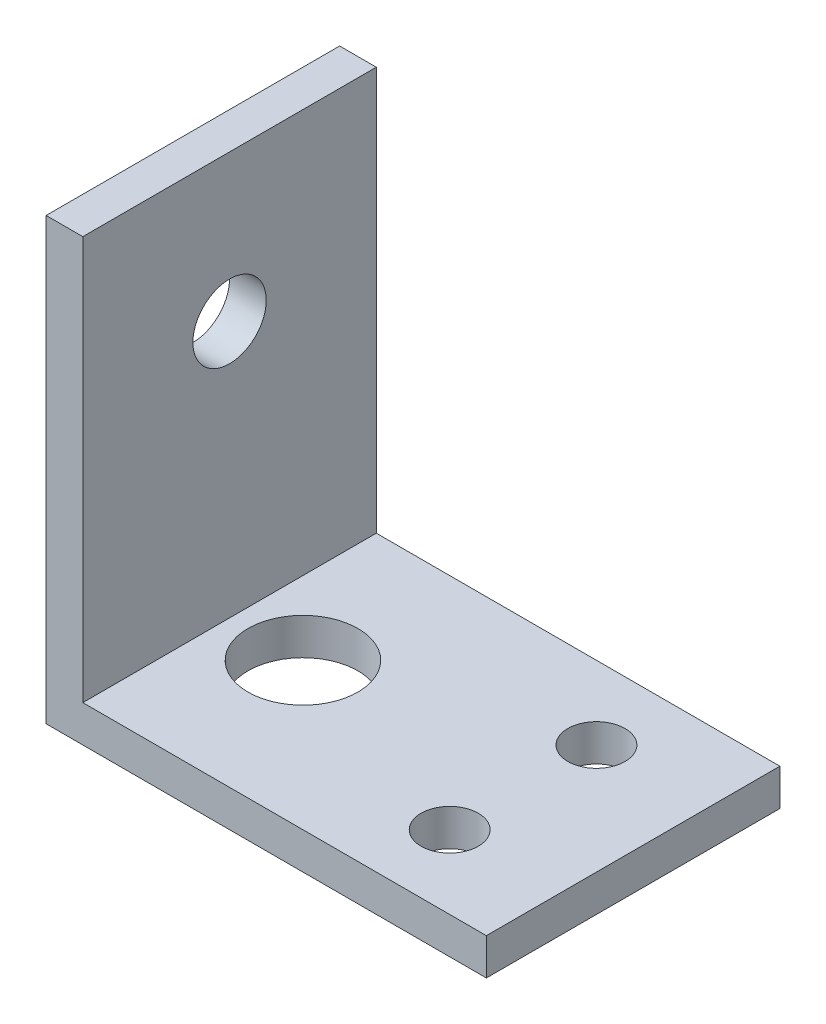
ISO-10303-21;
HEADER;
FILE_DESCRIPTION(('STEP AP214'),'2;1');
FILE_NAME('part.step','',(''),(''),'','','');
FILE_SCHEMA(('AUTOMOTIVE_DESIGN { 1 0 10303 214 1 1 1 1 }'));
ENDSEC;
DATA;
#1=APPLICATION_CONTEXT('core data for automotive mechanical design processes');
#2=APPLICATION_PROTOCOL_DEFINITION('international standard','automotive_design',2000,#1);
#3=PRODUCT_CONTEXT('',#1,'mechanical');
#4=PRODUCT('Part','Part','',(#3));
#5=PRODUCT_RELATED_PRODUCT_CATEGORY('part','',(#4));
#6=PRODUCT_DEFINITION_FORMATION('','',#4);
#7=PRODUCT_DEFINITION_CONTEXT('part definition',#1,'design');
#8=PRODUCT_DEFINITION('design','',#6,#7);
#9=PRODUCT_DEFINITION_SHAPE('','',#8);
#10=(LENGTH_UNIT() NAMED_UNIT(*) SI_UNIT(.MILLI.,.METRE.));
#11=(NAMED_UNIT(*) PLANE_ANGLE_UNIT() SI_UNIT($,.RADIAN.));
#12=(NAMED_UNIT(*) SI_UNIT($,.STERADIAN.) SOLID_ANGLE_UNIT());
#13=UNCERTAINTY_MEASURE_WITH_UNIT(LENGTH_MEASURE(1.E-05),#10,'distance_accuracy_value','');
#14=(GEOMETRIC_REPRESENTATION_CONTEXT(3) GLOBAL_UNCERTAINTY_ASSIGNED_CONTEXT((#13)) GLOBAL_UNIT_ASSIGNED_CONTEXT((#10,
#11,#12)) REPRESENTATION_CONTEXT('',''));
#15=CARTESIAN_POINT('',(0.,0.,0.));
#16=DIRECTION('',(0.,0.,1.));
#17=DIRECTION('',(1.,0.,0.));
#18=AXIS2_PLACEMENT_3D('',#15,#16,#17);
#19=CARTESIAN_POINT('',(3.175,0.,25.4));
#20=DIRECTION('',(-1.,0.,0.));
#21=DIRECTION('',(0.,0.,1.));
#22=AXIS2_PLACEMENT_3D('',#19,#20,#21);
#23=PLANE('',#22);
#24=CARTESIAN_POINT('',(3.175,25.4,12.7));
#25=DIRECTION('',(-1.,0.,0.));
#26=DIRECTION('',(0.,0.,1.));
#27=AXIS2_PLACEMENT_3D('',#24,#25,#26);
#28=CIRCLE('',#27,3.175);
#29=CARTESIAN_POINT('',(3.175,25.4,15.875));
#30=VERTEX_POINT('',#29);
#31=EDGE_CURVE('E148',#30,#30,#28,.T.);
#32=ORIENTED_EDGE('',*,*,#31,.T.);
#33=EDGE_LOOP('',(#32));
#34=FACE_BOUND('',#33,.T.);
#35=DIRECTION('',(0.,1.,0.));
#36=VECTOR('',#35,1.);
#37=CARTESIAN_POINT('',(3.175,0.,0.));
#38=LINE('',#37,#36);
#39=CARTESIAN_POINT('',(3.175,3.175,0.));
#40=VERTEX_POINT('',#39);
#41=CARTESIAN_POINT('',(3.175,38.1,0.));
#42=VERTEX_POINT('',#41);
#43=EDGE_CURVE('E118',#40,#42,#38,.T.);
#44=ORIENTED_EDGE('',*,*,#43,.T.);
#45=DIRECTION('',(0.,0.,-1.));
#46=VECTOR('',#45,1.);
#47=CARTESIAN_POINT('',(3.175,38.1,25.4));
#48=LINE('',#47,#46);
#49=CARTESIAN_POINT('',(3.175,38.1,25.4));
#50=VERTEX_POINT('',#49);
#51=EDGE_CURVE('E11',#50,#42,#48,.T.);
#52=ORIENTED_EDGE('',*,*,#51,.F.);
#53=DIRECTION('',(0.,1.,0.));
#54=VECTOR('',#53,1.);
#55=CARTESIAN_POINT('',(3.175,0.,25.4));
#56=LINE('',#55,#54);
#57=CARTESIAN_POINT('',(3.175,3.175,25.4));
#58=VERTEX_POINT('',#57);
#59=EDGE_CURVE('E83',#58,#50,#56,.T.);
#60=ORIENTED_EDGE('',*,*,#59,.F.);
#61=DIRECTION('',(0.,0.,-1.));
#62=VECTOR('',#61,1.);
#63=CARTESIAN_POINT('',(3.175,3.175,25.4));
#64=LINE('',#63,#62);
#65=EDGE_CURVE('E114',#58,#40,#64,.T.);
#66=ORIENTED_EDGE('',*,*,#65,.T.);
#67=EDGE_LOOP('',(#44,#52,#60,#66));
#68=FACE_BOUND('',#67,.T.);
#69=ADVANCED_FACE('F35',(#34,#68),#23,.F.);
#70=CARTESIAN_POINT('',(0.,38.1,25.4));
#71=DIRECTION('',(0.,1.,0.));
#72=DIRECTION('',(0.,0.,1.));
#73=AXIS2_PLACEMENT_3D('',#70,#71,#72);
#74=PLANE('',#73);
#75=DIRECTION('',(1.,0.,0.));
#76=VECTOR('',#75,1.);
#77=CARTESIAN_POINT('',(0.,38.1,0.));
#78=LINE('',#77,#76);
#79=CARTESIAN_POINT('',(0.,38.1,0.));
#80=VERTEX_POINT('',#79);
#81=EDGE_CURVE('E121',#80,#42,#78,.T.);
#82=ORIENTED_EDGE('',*,*,#81,.F.);
#83=DIRECTION('',(0.,0.,-1.));
#84=VECTOR('',#83,1.);
#85=CARTESIAN_POINT('',(0.,38.1,25.4));
#86=LINE('',#85,#84);
#87=CARTESIAN_POINT('',(0.,38.1,25.4));
#88=VERTEX_POINT('',#87);
#89=EDGE_CURVE('E44',#88,#80,#86,.T.);
#90=ORIENTED_EDGE('',*,*,#89,.F.);
#91=DIRECTION('',(1.,0.,0.));
#92=VECTOR('',#91,1.);
#93=CARTESIAN_POINT('',(0.,38.1,25.4));
#94=LINE('',#93,#92);
#95=EDGE_CURVE('E158',#88,#50,#94,.T.);
#96=ORIENTED_EDGE('',*,*,#95,.T.);
#97=ORIENTED_EDGE('',*,*,#51,.T.);
#98=EDGE_LOOP('',(#82,#90,#96,#97));
#99=FACE_BOUND('',#98,.T.);
#100=ADVANCED_FACE('F180',(#99),#74,.T.);
#101=CARTESIAN_POINT('',(0.,0.,25.4));
#102=DIRECTION('',(-1.,0.,0.));
#103=DIRECTION('',(0.,0.,1.));
#104=AXIS2_PLACEMENT_3D('',#101,#102,#103);
#105=PLANE('',#104);
#106=CARTESIAN_POINT('',(0.,25.4,12.7));
#107=DIRECTION('',(-1.,0.,0.));
#108=DIRECTION('',(0.,0.,1.));
#109=AXIS2_PLACEMENT_3D('',#106,#107,#108);
#110=CIRCLE('',#109,3.175);
#111=CARTESIAN_POINT('',(0.,25.4,15.875));
#112=VERTEX_POINT('',#111);
#113=EDGE_CURVE('E189',#112,#112,#110,.T.);
#114=ORIENTED_EDGE('',*,*,#113,.F.);
#115=EDGE_LOOP('',(#114));
#116=FACE_BOUND('',#115,.T.);
#117=DIRECTION('',(0.,1.,0.));
#118=VECTOR('',#117,1.);
#119=CARTESIAN_POINT('',(0.,0.,0.));
#120=LINE('',#119,#118);
#121=CARTESIAN_POINT('',(0.,0.,0.));
#122=VERTEX_POINT('',#121);
#123=EDGE_CURVE('E125',#122,#80,#120,.T.);
#124=ORIENTED_EDGE('',*,*,#123,.F.);
#125=DIRECTION('',(0.,0.,-1.));
#126=VECTOR('',#125,1.);
#127=CARTESIAN_POINT('',(0.,0.,25.4));
#128=LINE('',#127,#126);
#129=CARTESIAN_POINT('',(0.,0.,25.4));
#130=VERTEX_POINT('',#129);
#131=EDGE_CURVE('E104',#130,#122,#128,.T.);
#132=ORIENTED_EDGE('',*,*,#131,.F.);
#133=DIRECTION('',(0.,1.,0.));
#134=VECTOR('',#133,1.);
#135=CARTESIAN_POINT('',(0.,0.,25.4));
#136=LINE('',#135,#134);
#137=EDGE_CURVE('E110',#130,#88,#136,.T.);
#138=ORIENTED_EDGE('',*,*,#137,.T.);
#139=ORIENTED_EDGE('',*,*,#89,.T.);
#140=EDGE_LOOP('',(#124,#132,#138,#139));
#141=FACE_BOUND('',#140,.T.);
#142=ADVANCED_FACE('F162',(#116,#141),#105,.T.);
#143=CARTESIAN_POINT('',(0.,0.,25.4));
#144=DIRECTION('',(0.,-1.,0.));
#145=DIRECTION('',(0.,0.,-1.));
#146=AXIS2_PLACEMENT_3D('',#143,#144,#145);
#147=PLANE('',#146);
#148=CARTESIAN_POINT('',(28.575,0.,6.34999999999999));
#149=DIRECTION('',(0.,-1.,0.));
#150=DIRECTION('',(0.,0.,-1.));
#151=AXIS2_PLACEMENT_3D('',#148,#149,#150);
#152=CIRCLE('',#151,2.4765);
#153=CARTESIAN_POINT('',(28.575,0.,3.87349999999999));
#154=VERTEX_POINT('',#153);
#155=EDGE_CURVE('E137',#154,#154,#152,.T.);
#156=ORIENTED_EDGE('',*,*,#155,.F.);
#157=EDGE_LOOP('',(#156));
#158=FACE_BOUND('',#157,.T.);
#159=CARTESIAN_POINT('',(28.575,0.,19.05));
#160=DIRECTION('',(0.,-1.,0.));
#161=DIRECTION('',(0.,0.,-1.));
#162=AXIS2_PLACEMENT_3D('',#159,#160,#161);
#163=CIRCLE('',#162,2.47650000000001);
#164=CARTESIAN_POINT('',(28.575,0.,16.5735));
#165=VERTEX_POINT('',#164);
#166=EDGE_CURVE('E143',#165,#165,#163,.T.);
#167=ORIENTED_EDGE('',*,*,#166,.F.);
#168=EDGE_LOOP('',(#167));
#169=FACE_BOUND('',#168,.T.);
#170=CARTESIAN_POINT('',(9.525,0.,12.7));
#171=DIRECTION('',(0.,1.,0.));
#172=DIRECTION('',(0.,0.,1.));
#173=AXIS2_PLACEMENT_3D('',#170,#171,#172);
#174=CIRCLE('',#173,4.7625);
#175=CARTESIAN_POINT('',(9.525,0.,17.4625));
#176=VERTEX_POINT('',#175);
#177=EDGE_CURVE('E122',#176,#176,#174,.T.);
#178=ORIENTED_EDGE('',*,*,#177,.T.);
#179=EDGE_LOOP('',(#178));
#180=FACE_BOUND('',#179,.T.);
#181=DIRECTION('',(-1.,0.,0.));
#182=VECTOR('',#181,1.);
#183=CARTESIAN_POINT('',(0.,0.,0.));
#184=LINE('',#183,#182);
#185=CARTESIAN_POINT('',(38.1,0.,0.));
#186=VERTEX_POINT('',#185);
#187=EDGE_CURVE('E99',#186,#122,#184,.T.);
#188=ORIENTED_EDGE('',*,*,#187,.F.);
#189=DIRECTION('',(0.,0.,-1.));
#190=VECTOR('',#189,1.);
#191=CARTESIAN_POINT('',(38.1,0.,25.4));
#192=LINE('',#191,#190);
#193=CARTESIAN_POINT('',(38.1,0.,25.4));
#194=VERTEX_POINT('',#193);
#195=EDGE_CURVE('E94',#194,#186,#192,.T.);
#196=ORIENTED_EDGE('',*,*,#195,.F.);
#197=DIRECTION('',(-1.,0.,0.));
#198=VECTOR('',#197,1.);
#199=CARTESIAN_POINT('',(0.,0.,25.4));
#200=LINE('',#199,#198);
#201=EDGE_CURVE('E97',#194,#130,#200,.T.);
#202=ORIENTED_EDGE('',*,*,#201,.T.);
#203=ORIENTED_EDGE('',*,*,#131,.T.);
#204=EDGE_LOOP('',(#188,#196,#202,#203));
#205=FACE_BOUND('',#204,.T.);
#206=ADVANCED_FACE('F96',(#158,#169,#180,#205),#147,.T.);
#207=CARTESIAN_POINT('',(38.1,3.175,25.4));
#208=DIRECTION('',(1.,0.,0.));
#209=DIRECTION('',(0.,0.,-1.));
#210=AXIS2_PLACEMENT_3D('',#207,#208,#209);
#211=PLANE('',#210);
#212=DIRECTION('',(0.,-1.,0.));
#213=VECTOR('',#212,1.);
#214=CARTESIAN_POINT('',(38.1,3.175,0.));
#215=LINE('',#214,#213);
#216=CARTESIAN_POINT('',(38.1,3.175,0.));
#217=VERTEX_POINT('',#216);
#218=EDGE_CURVE('E129',#217,#186,#215,.T.);
#219=ORIENTED_EDGE('',*,*,#218,.F.);
#220=DIRECTION('',(0.,0.,-1.));
#221=VECTOR('',#220,1.);
#222=CARTESIAN_POINT('',(38.1,3.175,25.4));
#223=LINE('',#222,#221);
#224=CARTESIAN_POINT('',(38.1,3.175,25.4));
#225=VERTEX_POINT('',#224);
#226=EDGE_CURVE('E74',#225,#217,#223,.T.);
#227=ORIENTED_EDGE('',*,*,#226,.F.);
#228=DIRECTION('',(0.,-1.,0.));
#229=VECTOR('',#228,1.);
#230=CARTESIAN_POINT('',(38.1,3.175,25.4));
#231=LINE('',#230,#229);
#232=EDGE_CURVE('E108',#225,#194,#231,.T.);
#233=ORIENTED_EDGE('',*,*,#232,.T.);
#234=ORIENTED_EDGE('',*,*,#195,.T.);
#235=EDGE_LOOP('',(#219,#227,#233,#234));
#236=FACE_BOUND('',#235,.T.);
#237=ADVANCED_FACE('F112',(#236),#211,.T.);
#238=CARTESIAN_POINT('',(0.,3.175,25.4));
#239=DIRECTION('',(0.,-1.,0.));
#240=DIRECTION('',(0.,0.,-1.));
#241=AXIS2_PLACEMENT_3D('',#238,#239,#240);
#242=PLANE('',#241);
#243=CARTESIAN_POINT('',(28.575,3.175,6.34999999999999));
#244=DIRECTION('',(0.,-1.,0.));
#245=DIRECTION('',(0.,0.,-1.));
#246=AXIS2_PLACEMENT_3D('',#243,#244,#245);
#247=CIRCLE('',#246,2.4765);
#248=CARTESIAN_POINT('',(28.575,3.175,3.87349999999999));
#249=VERTEX_POINT('',#248);
#250=EDGE_CURVE('E38',#249,#249,#247,.T.);
#251=ORIENTED_EDGE('',*,*,#250,.T.);
#252=EDGE_LOOP('',(#251));
#253=FACE_BOUND('',#252,.T.);
#254=CARTESIAN_POINT('',(28.575,3.175,19.05));
#255=DIRECTION('',(0.,-1.,0.));
#256=DIRECTION('',(0.,0.,-1.));
#257=AXIS2_PLACEMENT_3D('',#254,#255,#256);
#258=CIRCLE('',#257,2.47650000000001);
#259=CARTESIAN_POINT('',(28.575,3.175,16.5735));
#260=VERTEX_POINT('',#259);
#261=EDGE_CURVE('E135',#260,#260,#258,.T.);
#262=ORIENTED_EDGE('',*,*,#261,.T.);
#263=EDGE_LOOP('',(#262));
#264=FACE_BOUND('',#263,.T.);
#265=CARTESIAN_POINT('',(9.525,3.175,12.7));
#266=DIRECTION('',(0.,1.,0.));
#267=DIRECTION('',(0.,0.,1.));
#268=AXIS2_PLACEMENT_3D('',#265,#266,#267);
#269=CIRCLE('',#268,4.7625);
#270=CARTESIAN_POINT('',(9.525,3.175,17.4625));
#271=VERTEX_POINT('',#270);
#272=EDGE_CURVE('E141',#271,#271,#269,.T.);
#273=ORIENTED_EDGE('',*,*,#272,.F.);
#274=EDGE_LOOP('',(#273));
#275=FACE_BOUND('',#274,.T.);
#276=DIRECTION('',(1.,0.,0.));
#277=VECTOR('',#276,1.);
#278=CARTESIAN_POINT('',(0.,3.175,0.));
#279=LINE('',#278,#277);
#280=EDGE_CURVE('E77',#217,#40,#279,.F.);
#281=ORIENTED_EDGE('',*,*,#280,.T.);
#282=ORIENTED_EDGE('',*,*,#65,.F.);
#283=DIRECTION('',(1.,0.,0.));
#284=VECTOR('',#283,1.);
#285=CARTESIAN_POINT('',(0.,3.175,25.4));
#286=LINE('',#285,#284);
#287=EDGE_CURVE('E53',#225,#58,#286,.F.);
#288=ORIENTED_EDGE('',*,*,#287,.F.);
#289=ORIENTED_EDGE('',*,*,#226,.T.);
#290=EDGE_LOOP('',(#281,#282,#288,#289));
#291=FACE_BOUND('',#290,.T.);
#292=ADVANCED_FACE('F168',(#253,#264,#275,#291),#242,.F.);
#293=CARTESIAN_POINT('',(0.,0.,25.4));
#294=DIRECTION('',(0.,0.,-1.));
#295=DIRECTION('',(-1.,0.,0.));
#296=AXIS2_PLACEMENT_3D('',#293,#294,#295);
#297=PLANE('',#296);
#298=ORIENTED_EDGE('',*,*,#59,.T.);
#299=ORIENTED_EDGE('',*,*,#95,.F.);
#300=ORIENTED_EDGE('',*,*,#137,.F.);
#301=ORIENTED_EDGE('',*,*,#201,.F.);
#302=ORIENTED_EDGE('',*,*,#232,.F.);
#303=ORIENTED_EDGE('',*,*,#287,.T.);
#304=EDGE_LOOP('',(#298,#299,#300,#301,#302,#303));
#305=FACE_BOUND('',#304,.T.);
#306=ADVANCED_FACE('F107',(#305),#297,.F.);
#307=CARTESIAN_POINT('',(0.,0.,0.));
#308=DIRECTION('',(0.,0.,-1.));
#309=DIRECTION('',(-1.,0.,0.));
#310=AXIS2_PLACEMENT_3D('',#307,#308,#309);
#311=PLANE('',#310);
#312=ORIENTED_EDGE('',*,*,#43,.F.);
#313=ORIENTED_EDGE('',*,*,#280,.F.);
#314=ORIENTED_EDGE('',*,*,#218,.T.);
#315=ORIENTED_EDGE('',*,*,#187,.T.);
#316=ORIENTED_EDGE('',*,*,#123,.T.);
#317=ORIENTED_EDGE('',*,*,#81,.T.);
#318=EDGE_LOOP('',(#312,#313,#314,#315,#316,#317));
#319=FACE_BOUND('',#318,.T.);
#320=ADVANCED_FACE('F166',(#319),#311,.T.);
#321=CARTESIAN_POINT('',(9.525,0.,12.7));
#322=DIRECTION('',(0.,1.,0.));
#323=DIRECTION('',(0.,0.,1.));
#324=AXIS2_PLACEMENT_3D('',#321,#322,#323);
#325=CYLINDRICAL_SURFACE('',#324,4.7625);
#326=ORIENTED_EDGE('',*,*,#177,.F.);
#327=EDGE_LOOP('',(#326));
#328=FACE_BOUND('',#327,.T.);
#329=ORIENTED_EDGE('',*,*,#272,.T.);
#330=EDGE_LOOP('',(#329));
#331=FACE_BOUND('',#330,.T.);
#332=ADVANCED_FACE('F209',(#328,#331),#325,.F.);
#333=CARTESIAN_POINT('',(28.575,38.1,19.05));
#334=DIRECTION('',(0.,-1.,0.));
#335=DIRECTION('',(0.,0.,-1.));
#336=AXIS2_PLACEMENT_3D('',#333,#334,#335);
#337=CYLINDRICAL_SURFACE('',#336,2.47650000000001);
#338=CARTESIAN_POINT('',(28.575,0.,16.5735));
#339=CARTESIAN_POINT('',(28.575,0.0330729166666659,16.5735));
#340=CARTESIAN_POINT('',(28.575,0.0661458333333318,16.5735));
#341=CARTESIAN_POINT('',(28.575,0.132291666666666,16.5735));
#342=CARTESIAN_POINT('',(28.575,0.165364583333334,16.5735));
#343=CARTESIAN_POINT('',(28.575,0.231510416666668,16.5735));
#344=CARTESIAN_POINT('',(28.575,0.264583333333334,16.5735));
#345=CARTESIAN_POINT('',(28.575,0.330729166666666,16.5735));
#346=CARTESIAN_POINT('',(28.575,0.363802083333332,16.5735));
#347=CARTESIAN_POINT('',(28.575,0.429947916666666,16.5735));
#348=CARTESIAN_POINT('',(28.575,0.463020833333334,16.5735));
#349=CARTESIAN_POINT('',(28.575,0.529166666666669,16.5735));
#350=CARTESIAN_POINT('',(28.575,0.562239583333334,16.5735));
#351=CARTESIAN_POINT('',(28.575,0.628385416666666,16.5735));
#352=CARTESIAN_POINT('',(28.575,0.661458333333332,16.5735));
#353=CARTESIAN_POINT('',(28.575,0.727604166666664,16.5735));
#354=CARTESIAN_POINT('',(28.575,0.76067708333333,16.5735));
#355=CARTESIAN_POINT('',(28.575,0.826822916666664,16.5735));
#356=CARTESIAN_POINT('',(28.575,0.859895833333332,16.5735));
#357=CARTESIAN_POINT('',(28.575,0.926041666666666,16.5735));
#358=CARTESIAN_POINT('',(28.575,0.959114583333332,16.5735));
#359=CARTESIAN_POINT('',(28.575,1.02526041666666,16.5735));
#360=CARTESIAN_POINT('',(28.575,1.05833333333333,16.5735));
#361=CARTESIAN_POINT('',(28.575,1.12447916666666,16.5735));
#362=CARTESIAN_POINT('',(28.575,1.15755208333333,16.5735));
#363=CARTESIAN_POINT('',(28.575,1.22369791666667,16.5735));
#364=CARTESIAN_POINT('',(28.575,1.25677083333333,16.5735));
#365=CARTESIAN_POINT('',(28.575,1.32291666666666,16.5735));
#366=CARTESIAN_POINT('',(28.575,1.35598958333333,16.5735));
#367=CARTESIAN_POINT('',(28.575,1.42213541666666,16.5735));
#368=CARTESIAN_POINT('',(28.575,1.45520833333333,16.5735));
#369=CARTESIAN_POINT('',(28.575,1.52135416666667,16.5735));
#370=CARTESIAN_POINT('',(28.575,1.55442708333333,16.5735));
#371=CARTESIAN_POINT('',(28.575,1.62057291666666,16.5735));
#372=CARTESIAN_POINT('',(28.575,1.65364583333333,16.5735));
#373=CARTESIAN_POINT('',(28.575,1.71979166666666,16.5735));
#374=CARTESIAN_POINT('',(28.575,1.75286458333333,16.5735));
#375=CARTESIAN_POINT('',(28.575,1.81901041666667,16.5735));
#376=CARTESIAN_POINT('',(28.575,1.85208333333333,16.5735));
#377=CARTESIAN_POINT('',(28.575,1.91822916666666,16.5735));
#378=CARTESIAN_POINT('',(28.575,1.95130208333333,16.5735));
#379=CARTESIAN_POINT('',(28.575,2.01744791666667,16.5735));
#380=CARTESIAN_POINT('',(28.575,2.05052083333333,16.5735));
#381=CARTESIAN_POINT('',(28.575,2.11666666666667,16.5735));
#382=CARTESIAN_POINT('',(28.575,2.14973958333333,16.5735));
#383=CARTESIAN_POINT('',(28.575,2.21588541666666,16.5735));
#384=CARTESIAN_POINT('',(28.575,2.24895833333333,16.5735));
#385=CARTESIAN_POINT('',(28.575,2.31510416666667,16.5735));
#386=CARTESIAN_POINT('',(28.575,2.34817708333333,16.5735));
#387=CARTESIAN_POINT('',(28.575,2.41432291666667,16.5735));
#388=CARTESIAN_POINT('',(28.575,2.44739583333333,16.5735));
#389=CARTESIAN_POINT('',(28.575,2.51354166666667,16.5735));
#390=CARTESIAN_POINT('',(28.575,2.54661458333333,16.5735));
#391=CARTESIAN_POINT('',(28.575,2.61276041666666,16.5735));
#392=CARTESIAN_POINT('',(28.575,2.64583333333333,16.5735));
#393=CARTESIAN_POINT('',(28.575,2.71197916666666,16.5735));
#394=CARTESIAN_POINT('',(28.575,2.74505208333333,16.5735));
#395=CARTESIAN_POINT('',(28.575,2.81119791666667,16.5735));
#396=CARTESIAN_POINT('',(28.575,2.84427083333333,16.5735));
#397=CARTESIAN_POINT('',(28.575,2.91041666666666,16.5735));
#398=CARTESIAN_POINT('',(28.575,2.94348958333333,16.5735));
#399=CARTESIAN_POINT('',(28.575,3.00963541666666,16.5735));
#400=CARTESIAN_POINT('',(28.575,3.04270833333333,16.5735));
#401=CARTESIAN_POINT('',(28.575,3.10885416666667,16.5735));
#402=CARTESIAN_POINT('',(28.575,3.14192708333333,16.5735));
#403=CARTESIAN_POINT('',(28.575,3.175,16.5735));
#404=B_SPLINE_CURVE_WITH_KNOTS('',3,(#338,#339,#340,#341,#342,#343,#344,#345,#346,#347,#348,
#349,#350,#351,#352,#353,#354,#355,#356,#357,#358,#359,#360,#361,#362,#363,#364,#365,#366,#367,
#368,#369,#370,#371,#372,#373,#374,#375,#376,#377,#378,#379,#380,#381,#382,#383,#384,#385,#386,
#387,#388,#389,#390,#391,#392,#393,#394,#395,#396,#397,#398,#399,#400,#401,#402,#403),
.UNSPECIFIED.,.F.,.F.,(4,2,2,2,2,2,2,2,2,2,2,2,2,2,2,2,2,2,2,2,2,2,2,2,2,2,2,2,2,2,2,2,4),(0.,
0.0992187499999977,0.198437500000002,0.29765625,0.396874999999998,0.496093750000003,0.5953125,
0.694531249999998,0.793749999999996,0.892968750000001,0.992187499999998,1.09140625,1.190625,
1.28984375,1.3890625,1.48828125,1.5875,1.68671875,1.7859375,1.88515625,1.984375,2.08359375,
2.1828125,2.28203125,2.38125,2.48046875,2.5796875,2.67890624999999,2.778125,2.87734375,
2.97656249999999,3.07578125,3.175),.UNSPECIFIED.);
#405=EDGE_CURVE('BSEAM212',#165,#260,#404,.T.);
#406=ORIENTED_EDGE('',*,*,#166,.T.);
#407=ORIENTED_EDGE('',*,*,#261,.F.);
#408=ORIENTED_EDGE('',*,*,#405,.T.);
#409=ORIENTED_EDGE('',*,*,#405,.F.);
#410=EDGE_LOOP('',(#406,#408,#407,#409));
#411=FACE_BOUND('',#410,.T.);
#412=ADVANCED_FACE('F212',(#411),#337,.F.);
#413=CARTESIAN_POINT('',(28.575,38.1,6.34999999999999));
#414=DIRECTION('',(0.,-1.,0.));
#415=DIRECTION('',(0.,0.,-1.));
#416=AXIS2_PLACEMENT_3D('',#413,#414,#415);
#417=CYLINDRICAL_SURFACE('',#416,2.4765);
#418=CARTESIAN_POINT('',(28.575,0.,3.87349999999999));
#419=CARTESIAN_POINT('',(28.575,0.0330729166666659,3.87349999999999));
#420=CARTESIAN_POINT('',(28.575,0.0661458333333318,3.87349999999999));
#421=CARTESIAN_POINT('',(28.575,0.132291666666666,3.87349999999999));
#422=CARTESIAN_POINT('',(28.575,0.165364583333334,3.87349999999999));
#423=CARTESIAN_POINT('',(28.575,0.231510416666668,3.87349999999999));
#424=CARTESIAN_POINT('',(28.575,0.264583333333334,3.87349999999999));
#425=CARTESIAN_POINT('',(28.575,0.330729166666666,3.87349999999999));
#426=CARTESIAN_POINT('',(28.575,0.363802083333332,3.87349999999999));
#427=CARTESIAN_POINT('',(28.575,0.429947916666666,3.87349999999999));
#428=CARTESIAN_POINT('',(28.575,0.463020833333334,3.87349999999999));
#429=CARTESIAN_POINT('',(28.575,0.529166666666669,3.87349999999999));
#430=CARTESIAN_POINT('',(28.575,0.562239583333334,3.87349999999999));
#431=CARTESIAN_POINT('',(28.575,0.628385416666666,3.87349999999999));
#432=CARTESIAN_POINT('',(28.575,0.661458333333332,3.87349999999999));
#433=CARTESIAN_POINT('',(28.575,0.727604166666664,3.87349999999999));
#434=CARTESIAN_POINT('',(28.575,0.76067708333333,3.87349999999999));
#435=CARTESIAN_POINT('',(28.575,0.826822916666664,3.87349999999999));
#436=CARTESIAN_POINT('',(28.575,0.859895833333332,3.87349999999999));
#437=CARTESIAN_POINT('',(28.575,0.926041666666666,3.87349999999999));
#438=CARTESIAN_POINT('',(28.575,0.959114583333332,3.87349999999999));
#439=CARTESIAN_POINT('',(28.575,1.02526041666666,3.87349999999999));
#440=CARTESIAN_POINT('',(28.575,1.05833333333333,3.87349999999999));
#441=CARTESIAN_POINT('',(28.575,1.12447916666666,3.87349999999999));
#442=CARTESIAN_POINT('',(28.575,1.15755208333333,3.87349999999999));
#443=CARTESIAN_POINT('',(28.575,1.22369791666667,3.87349999999999));
#444=CARTESIAN_POINT('',(28.575,1.25677083333333,3.87349999999999));
#445=CARTESIAN_POINT('',(28.575,1.32291666666666,3.87349999999999));
#446=CARTESIAN_POINT('',(28.575,1.35598958333333,3.87349999999999));
#447=CARTESIAN_POINT('',(28.575,1.42213541666666,3.87349999999999));
#448=CARTESIAN_POINT('',(28.575,1.45520833333333,3.87349999999999));
#449=CARTESIAN_POINT('',(28.575,1.52135416666667,3.87349999999999));
#450=CARTESIAN_POINT('',(28.575,1.55442708333333,3.87349999999999));
#451=CARTESIAN_POINT('',(28.575,1.62057291666666,3.87349999999999));
#452=CARTESIAN_POINT('',(28.575,1.65364583333333,3.87349999999999));
#453=CARTESIAN_POINT('',(28.575,1.71979166666666,3.87349999999999));
#454=CARTESIAN_POINT('',(28.575,1.75286458333333,3.87349999999999));
#455=CARTESIAN_POINT('',(28.575,1.81901041666667,3.87349999999999));
#456=CARTESIAN_POINT('',(28.575,1.85208333333333,3.87349999999999));
#457=CARTESIAN_POINT('',(28.575,1.91822916666666,3.87349999999999));
#458=CARTESIAN_POINT('',(28.575,1.95130208333333,3.87349999999999));
#459=CARTESIAN_POINT('',(28.575,2.01744791666667,3.87349999999999));
#460=CARTESIAN_POINT('',(28.575,2.05052083333333,3.87349999999999));
#461=CARTESIAN_POINT('',(28.575,2.11666666666667,3.87349999999999));
#462=CARTESIAN_POINT('',(28.575,2.14973958333333,3.87349999999999));
#463=CARTESIAN_POINT('',(28.575,2.21588541666666,3.87349999999999));
#464=CARTESIAN_POINT('',(28.575,2.24895833333333,3.87349999999999));
#465=CARTESIAN_POINT('',(28.575,2.31510416666667,3.87349999999999));
#466=CARTESIAN_POINT('',(28.575,2.34817708333333,3.87349999999999));
#467=CARTESIAN_POINT('',(28.575,2.41432291666667,3.87349999999999));
#468=CARTESIAN_POINT('',(28.575,2.44739583333333,3.87349999999999));
#469=CARTESIAN_POINT('',(28.575,2.51354166666667,3.87349999999999));
#470=CARTESIAN_POINT('',(28.575,2.54661458333333,3.87349999999999));
#471=CARTESIAN_POINT('',(28.575,2.61276041666666,3.87349999999999));
#472=CARTESIAN_POINT('',(28.575,2.64583333333333,3.87349999999999));
#473=CARTESIAN_POINT('',(28.575,2.71197916666666,3.87349999999999));
#474=CARTESIAN_POINT('',(28.575,2.74505208333333,3.87349999999999));
#475=CARTESIAN_POINT('',(28.575,2.81119791666667,3.87349999999999));
#476=CARTESIAN_POINT('',(28.575,2.84427083333333,3.87349999999999));
#477=CARTESIAN_POINT('',(28.575,2.91041666666666,3.87349999999999));
#478=CARTESIAN_POINT('',(28.575,2.94348958333333,3.87349999999999));
#479=CARTESIAN_POINT('',(28.575,3.00963541666666,3.87349999999999));
#480=CARTESIAN_POINT('',(28.575,3.04270833333333,3.87349999999999));
#481=CARTESIAN_POINT('',(28.575,3.10885416666667,3.87349999999999));
#482=CARTESIAN_POINT('',(28.575,3.14192708333333,3.87349999999999));
#483=CARTESIAN_POINT('',(28.575,3.175,3.87349999999999));
#484=B_SPLINE_CURVE_WITH_KNOTS('',3,(#418,#419,#420,#421,#422,#423,#424,#425,#426,#427,#428,
#429,#430,#431,#432,#433,#434,#435,#436,#437,#438,#439,#440,#441,#442,#443,#444,#445,#446,#447,
#448,#449,#450,#451,#452,#453,#454,#455,#456,#457,#458,#459,#460,#461,#462,#463,#464,#465,#466,
#467,#468,#469,#470,#471,#472,#473,#474,#475,#476,#477,#478,#479,#480,#481,#482,#483),
.UNSPECIFIED.,.F.,.F.,(4,2,2,2,2,2,2,2,2,2,2,2,2,2,2,2,2,2,2,2,2,2,2,2,2,2,2,2,2,2,2,2,4),(0.,
0.0992187499999977,0.198437500000002,0.29765625,0.396874999999998,0.496093750000003,0.5953125,
0.694531249999998,0.793749999999996,0.892968750000001,0.992187499999998,1.09140625,1.190625,
1.28984375,1.3890625,1.48828125,1.5875,1.68671875,1.7859375,1.88515625,1.984375,2.08359375,
2.1828125,2.28203125,2.38125,2.48046875,2.5796875,2.67890624999999,2.778125,2.87734375,
2.97656249999999,3.07578125,3.175),.UNSPECIFIED.);
#485=EDGE_CURVE('BSEAM220',#154,#249,#484,.T.);
#486=ORIENTED_EDGE('',*,*,#155,.T.);
#487=ORIENTED_EDGE('',*,*,#250,.F.);
#488=ORIENTED_EDGE('',*,*,#485,.T.);
#489=ORIENTED_EDGE('',*,*,#485,.F.);
#490=EDGE_LOOP('',(#486,#488,#487,#489));
#491=FACE_BOUND('',#490,.T.);
#492=ADVANCED_FACE('F220',(#491),#417,.F.);
#493=CARTESIAN_POINT('',(38.1,25.4,12.7));
#494=DIRECTION('',(-1.,0.,0.));
#495=DIRECTION('',(0.,0.,1.));
#496=AXIS2_PLACEMENT_3D('',#493,#494,#495);
#497=CYLINDRICAL_SURFACE('',#496,3.175);
#498=CARTESIAN_POINT('',(0.,25.4,15.875));
#499=CARTESIAN_POINT('',(0.0330729166666659,25.4,15.875));
#500=CARTESIAN_POINT('',(0.0661458333333318,25.4,15.875));
#501=CARTESIAN_POINT('',(0.132291666666666,25.4,15.875));
#502=CARTESIAN_POINT('',(0.165364583333334,25.4,15.875));
#503=CARTESIAN_POINT('',(0.231510416666668,25.4,15.875));
#504=CARTESIAN_POINT('',(0.264583333333334,25.4,15.875));
#505=CARTESIAN_POINT('',(0.330729166666666,25.4,15.875));
#506=CARTESIAN_POINT('',(0.363802083333332,25.4,15.875));
#507=CARTESIAN_POINT('',(0.429947916666666,25.4,15.875));
#508=CARTESIAN_POINT('',(0.463020833333334,25.4,15.875));
#509=CARTESIAN_POINT('',(0.529166666666669,25.4,15.875));
#510=CARTESIAN_POINT('',(0.562239583333334,25.4,15.875));
#511=CARTESIAN_POINT('',(0.628385416666666,25.4,15.875));
#512=CARTESIAN_POINT('',(0.661458333333332,25.4,15.875));
#513=CARTESIAN_POINT('',(0.727604166666664,25.4,15.875));
#514=CARTESIAN_POINT('',(0.76067708333333,25.4,15.875));
#515=CARTESIAN_POINT('',(0.826822916666664,25.4,15.875));
#516=CARTESIAN_POINT('',(0.859895833333332,25.4,15.875));
#517=CARTESIAN_POINT('',(0.926041666666666,25.4,15.875));
#518=CARTESIAN_POINT('',(0.959114583333332,25.4,15.875));
#519=CARTESIAN_POINT('',(1.02526041666666,25.4,15.875));
#520=CARTESIAN_POINT('',(1.05833333333333,25.4,15.875));
#521=CARTESIAN_POINT('',(1.12447916666666,25.4,15.875));
#522=CARTESIAN_POINT('',(1.15755208333333,25.4,15.875));
#523=CARTESIAN_POINT('',(1.22369791666667,25.4,15.875));
#524=CARTESIAN_POINT('',(1.25677083333333,25.4,15.875));
#525=CARTESIAN_POINT('',(1.32291666666666,25.4,15.875));
#526=CARTESIAN_POINT('',(1.35598958333333,25.4,15.875));
#527=CARTESIAN_POINT('',(1.42213541666666,25.4,15.875));
#528=CARTESIAN_POINT('',(1.45520833333333,25.4,15.875));
#529=CARTESIAN_POINT('',(1.52135416666667,25.4,15.875));
#530=CARTESIAN_POINT('',(1.55442708333333,25.4,15.875));
#531=CARTESIAN_POINT('',(1.62057291666666,25.4,15.875));
#532=CARTESIAN_POINT('',(1.65364583333333,25.4,15.875));
#533=CARTESIAN_POINT('',(1.71979166666666,25.4,15.875));
#534=CARTESIAN_POINT('',(1.75286458333333,25.4,15.875));
#535=CARTESIAN_POINT('',(1.81901041666667,25.4,15.875));
#536=CARTESIAN_POINT('',(1.85208333333333,25.4,15.875));
#537=CARTESIAN_POINT('',(1.91822916666666,25.4,15.875));
#538=CARTESIAN_POINT('',(1.95130208333333,25.4,15.875));
#539=CARTESIAN_POINT('',(2.01744791666667,25.4,15.875));
#540=CARTESIAN_POINT('',(2.05052083333333,25.4,15.875));
#541=CARTESIAN_POINT('',(2.11666666666667,25.4,15.875));
#542=CARTESIAN_POINT('',(2.14973958333333,25.4,15.875));
#543=CARTESIAN_POINT('',(2.21588541666666,25.4,15.875));
#544=CARTESIAN_POINT('',(2.24895833333333,25.4,15.875));
#545=CARTESIAN_POINT('',(2.31510416666667,25.4,15.875));
#546=CARTESIAN_POINT('',(2.34817708333333,25.4,15.875));
#547=CARTESIAN_POINT('',(2.41432291666667,25.4,15.875));
#548=CARTESIAN_POINT('',(2.44739583333333,25.4,15.875));
#549=CARTESIAN_POINT('',(2.51354166666667,25.4,15.875));
#550=CARTESIAN_POINT('',(2.54661458333333,25.4,15.875));
#551=CARTESIAN_POINT('',(2.61276041666666,25.4,15.875));
#552=CARTESIAN_POINT('',(2.64583333333333,25.4,15.875));
#553=CARTESIAN_POINT('',(2.71197916666666,25.4,15.875));
#554=CARTESIAN_POINT('',(2.74505208333333,25.4,15.875));
#555=CARTESIAN_POINT('',(2.81119791666667,25.4,15.875));
#556=CARTESIAN_POINT('',(2.84427083333333,25.4,15.875));
#557=CARTESIAN_POINT('',(2.91041666666666,25.4,15.875));
#558=CARTESIAN_POINT('',(2.94348958333333,25.4,15.875));
#559=CARTESIAN_POINT('',(3.00963541666666,25.4,15.875));
#560=CARTESIAN_POINT('',(3.04270833333333,25.4,15.875));
#561=CARTESIAN_POINT('',(3.10885416666667,25.4,15.875));
#562=CARTESIAN_POINT('',(3.14192708333333,25.4,15.875));
#563=CARTESIAN_POINT('',(3.175,25.4,15.875));
#564=B_SPLINE_CURVE_WITH_KNOTS('',3,(#498,#499,#500,#501,#502,#503,#504,#505,#506,#507,#508,
#509,#510,#511,#512,#513,#514,#515,#516,#517,#518,#519,#520,#521,#522,#523,#524,#525,#526,#527,
#528,#529,#530,#531,#532,#533,#534,#535,#536,#537,#538,#539,#540,#541,#542,#543,#544,#545,#546,
#547,#548,#549,#550,#551,#552,#553,#554,#555,#556,#557,#558,#559,#560,#561,#562,#563),
.UNSPECIFIED.,.F.,.F.,(4,2,2,2,2,2,2,2,2,2,2,2,2,2,2,2,2,2,2,2,2,2,2,2,2,2,2,2,2,2,2,2,4),(0.,
0.0992187499999977,0.198437500000002,0.29765625,0.396874999999998,0.496093750000003,0.5953125,
0.694531249999998,0.793749999999996,0.892968750000001,0.992187499999998,1.09140625,1.190625,
1.28984375,1.3890625,1.48828125,1.5875,1.68671875,1.7859375,1.88515625,1.984375,2.08359375,
2.1828125,2.28203125,2.38125,2.48046875,2.5796875,2.67890624999999,2.778125,2.87734375,
2.97656249999999,3.07578125,3.175),.UNSPECIFIED.);
#565=EDGE_CURVE('BSEAM193',#112,#30,#564,.T.);
#566=ORIENTED_EDGE('',*,*,#113,.T.);
#567=ORIENTED_EDGE('',*,*,#31,.F.);
#568=ORIENTED_EDGE('',*,*,#565,.T.);
#569=ORIENTED_EDGE('',*,*,#565,.F.);
#570=EDGE_LOOP('',(#566,#568,#567,#569));
#571=FACE_BOUND('',#570,.T.);
#572=ADVANCED_FACE('F193',(#571),#497,.F.);
#573=CLOSED_SHELL('',(#69,#100,#142,#206,#237,#292,#306,#320,#332,#412,#492,#572));
#574=MANIFOLD_SOLID_BREP('B2',#573);
#575=ADVANCED_BREP_SHAPE_REPRESENTATION('',(#18,#574),#14);
#576=SHAPE_DEFINITION_REPRESENTATION(#9,#575);
ENDSEC;
END-ISO-10303-21;
